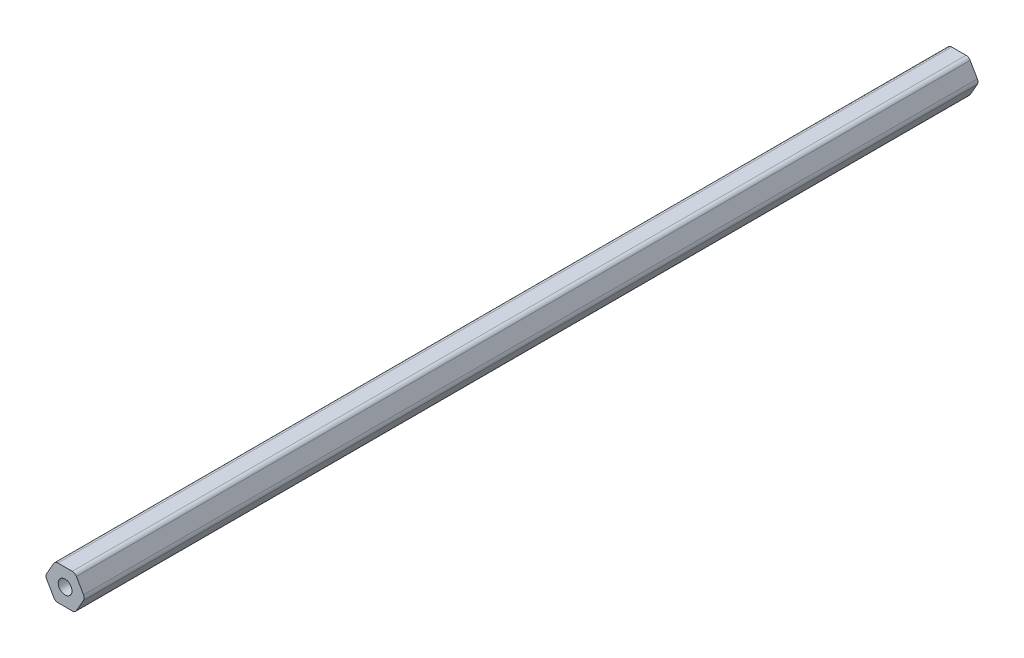
ISO-10303-21;
HEADER;
FILE_DESCRIPTION(('STEP AP214'),'2;1');
FILE_NAME('part.step','',(''),(''),'','','');
FILE_SCHEMA(('AUTOMOTIVE_DESIGN { 1 0 10303 214 1 1 1 1 }'));
ENDSEC;
DATA;
#1=APPLICATION_CONTEXT('core data for automotive mechanical design processes');
#2=APPLICATION_PROTOCOL_DEFINITION('international standard','automotive_design',2000,#1);
#3=PRODUCT_CONTEXT('',#1,'mechanical');
#4=PRODUCT('Part','Part','',(#3));
#5=PRODUCT_RELATED_PRODUCT_CATEGORY('part','',(#4));
#6=PRODUCT_DEFINITION_FORMATION('','',#4);
#7=PRODUCT_DEFINITION_CONTEXT('part definition',#1,'design');
#8=PRODUCT_DEFINITION('design','',#6,#7);
#9=PRODUCT_DEFINITION_SHAPE('','',#8);
#10=(LENGTH_UNIT() NAMED_UNIT(*) SI_UNIT(.MILLI.,.METRE.));
#11=(NAMED_UNIT(*) PLANE_ANGLE_UNIT() SI_UNIT($,.RADIAN.));
#12=(NAMED_UNIT(*) SI_UNIT($,.STERADIAN.) SOLID_ANGLE_UNIT());
#13=UNCERTAINTY_MEASURE_WITH_UNIT(LENGTH_MEASURE(1.E-05),#10,'distance_accuracy_value','');
#14=(GEOMETRIC_REPRESENTATION_CONTEXT(3) GLOBAL_UNCERTAINTY_ASSIGNED_CONTEXT((#13)) GLOBAL_UNIT_ASSIGNED_CONTEXT((#10,
#11,#12)) REPRESENTATION_CONTEXT('',''));
#15=CARTESIAN_POINT('',(0.,0.,0.));
#16=DIRECTION('',(0.,0.,1.));
#17=DIRECTION('',(1.,0.,0.));
#18=AXIS2_PLACEMENT_3D('',#15,#16,#17);
#19=CARTESIAN_POINT('',(0.,0.,330.2));
#20=DIRECTION('',(0.,0.,1.));
#21=DIRECTION('',(1.,0.,0.));
#22=AXIS2_PLACEMENT_3D('',#19,#20,#21);
#23=PLANE('',#22);
#24=DIRECTION('',(-0.499999999999995,-0.866025403784442,0.));
#25=VECTOR('',#24,1.);
#26=CARTESIAN_POINT('',(-4.29020386201017,9.04112787707909,330.2));
#27=LINE('',#26,#25);
#28=CARTESIAN_POINT('',(-4.80346825131974,8.15212787707908,330.2));
#29=VERTEX_POINT('',#28);
#30=CARTESIAN_POINT('',(-7.44311368205469,3.58012787707905,330.2));
#31=VERTEX_POINT('',#30);
#32=EDGE_CURVE('E273',#29,#31,#27,.T.);
#33=ORIENTED_EDGE('',*,*,#32,.T.);
#34=CARTESIAN_POINT('',(-5.90332051412595,2.69112787707906,330.2));
#35=DIRECTION('',(0.,0.,1.));
#36=DIRECTION('',(1.,0.,0.));
#37=AXIS2_PLACEMENT_3D('',#34,#35,#36);
#38=CIRCLE('',#37,1.778);
#39=CARTESIAN_POINT('',(-7.44311368205468,1.80212787707905,330.2));
#40=VERTEX_POINT('',#39);
#41=EDGE_CURVE('E210',#31,#40,#38,.T.);
#42=ORIENTED_EDGE('',*,*,#41,.T.);
#43=DIRECTION('',(0.500000000000007,-0.866025403784434,0.));
#44=VECTOR('',#43,1.);
#45=CARTESIAN_POINT('',(-7.95637807136426,2.69112787707905,330.2));
#46=LINE('',#45,#44);
#47=CARTESIAN_POINT('',(-4.80346825131967,-2.76987212292094,330.2));
#48=VERTEX_POINT('',#47);
#49=EDGE_CURVE('E155',#40,#48,#46,.T.);
#50=ORIENTED_EDGE('',*,*,#49,.T.);
#51=CARTESIAN_POINT('',(-3.26367508339094,-1.88087212292093,330.2));
#52=DIRECTION('',(0.,0.,1.));
#53=DIRECTION('',(1.,0.,0.));
#54=AXIS2_PLACEMENT_3D('',#51,#52,#53);
#55=CIRCLE('',#54,1.778);
#56=CARTESIAN_POINT('',(-3.26367508339092,-3.65887212292093,330.2));
#57=VERTEX_POINT('',#56);
#58=EDGE_CURVE('E66',#48,#57,#55,.T.);
#59=ORIENTED_EDGE('',*,*,#58,.T.);
#60=DIRECTION('',(1.,0.,0.));
#61=VECTOR('',#60,1.);
#62=CARTESIAN_POINT('',(-4.29020386201008,-3.65887212292094,330.2));
#63=LINE('',#62,#61);
#64=CARTESIAN_POINT('',(2.01561577807904,-3.65887212292087,330.2));
#65=VERTEX_POINT('',#64);
#66=EDGE_CURVE('E177',#57,#65,#63,.T.);
#67=ORIENTED_EDGE('',*,*,#66,.T.);
#68=CARTESIAN_POINT('',(2.01561577807902,-1.88087212292087,330.2));
#69=DIRECTION('',(0.,0.,1.));
#70=DIRECTION('',(1.,0.,0.));
#71=AXIS2_PLACEMENT_3D('',#68,#69,#70);
#72=CIRCLE('',#71,1.778);
#73=CARTESIAN_POINT('',(3.55540894600776,-2.76987212292086,330.2));
#74=VERTEX_POINT('',#73);
#75=EDGE_CURVE('E202',#65,#74,#72,.T.);
#76=ORIENTED_EDGE('',*,*,#75,.T.);
#77=DIRECTION('',(0.499999999999995,0.866025403784441,0.));
#78=VECTOR('',#77,1.);
#79=CARTESIAN_POINT('',(3.04214455669819,-3.65887212292086,330.2));
#80=LINE('',#79,#78);
#81=CARTESIAN_POINT('',(6.19505437674267,1.8021278770791,330.2));
#82=VERTEX_POINT('',#81);
#83=EDGE_CURVE('E170',#74,#82,#80,.T.);
#84=ORIENTED_EDGE('',*,*,#83,.T.);
#85=CARTESIAN_POINT('',(4.65526120881393,2.69112787707909,330.2));
#86=DIRECTION('',(0.,0.,1.));
#87=DIRECTION('',(1.,0.,0.));
#88=AXIS2_PLACEMENT_3D('',#85,#86,#87);
#89=CIRCLE('',#88,1.778);
#90=CARTESIAN_POINT('',(6.19505437674266,3.58012787707909,330.2));
#91=VERTEX_POINT('',#90);
#92=EDGE_CURVE('E199',#82,#91,#89,.T.);
#93=ORIENTED_EDGE('',*,*,#92,.T.);
#94=DIRECTION('',(-0.500000000000001,0.866025403784438,0.));
#95=VECTOR('',#94,1.);
#96=CARTESIAN_POINT('',(6.70831876605224,2.6911278770791,330.2));
#97=LINE('',#96,#95);
#98=CARTESIAN_POINT('',(3.55540894600768,8.15212787707911,330.2));
#99=VERTEX_POINT('',#98);
#100=EDGE_CURVE('E239',#91,#99,#97,.T.);
#101=ORIENTED_EDGE('',*,*,#100,.T.);
#102=CARTESIAN_POINT('',(2.01561577807895,7.26312787707911,330.2));
#103=DIRECTION('',(0.,0.,1.));
#104=DIRECTION('',(1.,0.,0.));
#105=AXIS2_PLACEMENT_3D('',#102,#103,#104);
#106=CIRCLE('',#105,1.778);
#107=CARTESIAN_POINT('',(2.01561577807894,9.04112787707911,330.2));
#108=VERTEX_POINT('',#107);
#109=EDGE_CURVE('E196',#99,#108,#106,.T.);
#110=ORIENTED_EDGE('',*,*,#109,.T.);
#111=DIRECTION('',(-1.,0.,0.));
#112=VECTOR('',#111,1.);
#113=CARTESIAN_POINT('',(3.0421445566981,9.04112787707911,330.2));
#114=LINE('',#113,#112);
#115=CARTESIAN_POINT('',(-3.26367508339101,9.04112787707909,330.2));
#116=VERTEX_POINT('',#115);
#117=EDGE_CURVE('E252',#108,#116,#114,.T.);
#118=ORIENTED_EDGE('',*,*,#117,.T.);
#119=CARTESIAN_POINT('',(-3.263675083391,7.26312787707909,330.2));
#120=DIRECTION('',(0.,0.,1.));
#121=DIRECTION('',(1.,0.,0.));
#122=AXIS2_PLACEMENT_3D('',#119,#120,#121);
#123=CIRCLE('',#122,1.778);
#124=EDGE_CURVE('E207',#116,#29,#123,.T.);
#125=ORIENTED_EDGE('',*,*,#124,.T.);
#126=EDGE_LOOP('',(#33,#42,#50,#59,#67,#76,#84,#93,#101,#110,#118,#125));
#127=FACE_BOUND('',#126,.T.);
#128=CARTESIAN_POINT('',(-0.624029652656013,2.6911278770791,330.2));
#129=DIRECTION('',(0.,0.,1.));
#130=DIRECTION('',(1.,0.,0.));
#131=AXIS2_PLACEMENT_3D('',#128,#129,#130);
#132=CIRCLE('',#131,2.54);
#133=CARTESIAN_POINT('',(1.91597034734399,2.6911278770791,330.2));
#134=VERTEX_POINT('',#133);
#135=EDGE_CURVE('E268',#134,#134,#132,.T.);
#136=ORIENTED_EDGE('',*,*,#135,.F.);
#137=EDGE_LOOP('',(#136));
#138=FACE_BOUND('',#137,.T.);
#139=ADVANCED_FACE('F43',(#127,#138),#23,.T.);
#140=CARTESIAN_POINT('',(0.,0.,0.));
#141=DIRECTION('',(0.,0.,1.));
#142=DIRECTION('',(1.,0.,0.));
#143=AXIS2_PLACEMENT_3D('',#140,#141,#142);
#144=PLANE('',#143);
#145=DIRECTION('',(0.500000000000007,-0.866025403784434,0.));
#146=VECTOR('',#145,1.);
#147=CARTESIAN_POINT('',(-7.95637807136426,2.69112787707905,0.));
#148=LINE('',#147,#146);
#149=CARTESIAN_POINT('',(-7.44311368205468,1.80212787707905,0.));
#150=VERTEX_POINT('',#149);
#151=CARTESIAN_POINT('',(-4.80346825131967,-2.76987212292094,0.));
#152=VERTEX_POINT('',#151);
#153=EDGE_CURVE('E153',#150,#152,#148,.T.);
#154=ORIENTED_EDGE('',*,*,#153,.F.);
#155=CARTESIAN_POINT('',(-5.90332051412595,2.69112787707906,0.));
#156=DIRECTION('',(0.,0.,1.));
#157=DIRECTION('',(1.,0.,0.));
#158=AXIS2_PLACEMENT_3D('',#155,#156,#157);
#159=CIRCLE('',#158,1.778);
#160=CARTESIAN_POINT('',(-7.44311368205469,3.58012787707905,0.));
#161=VERTEX_POINT('',#160);
#162=EDGE_CURVE('E135',#150,#161,#159,.F.);
#163=ORIENTED_EDGE('',*,*,#162,.T.);
#164=DIRECTION('',(-0.499999999999995,-0.866025403784442,0.));
#165=VECTOR('',#164,1.);
#166=CARTESIAN_POINT('',(-4.29020386201017,9.04112787707909,0.));
#167=LINE('',#166,#165);
#168=CARTESIAN_POINT('',(-4.80346825131974,8.15212787707908,0.));
#169=VERTEX_POINT('',#168);
#170=EDGE_CURVE('E166',#169,#161,#167,.T.);
#171=ORIENTED_EDGE('',*,*,#170,.F.);
#172=CARTESIAN_POINT('',(-3.263675083391,7.26312787707909,0.));
#173=DIRECTION('',(0.,0.,1.));
#174=DIRECTION('',(1.,0.,0.));
#175=AXIS2_PLACEMENT_3D('',#172,#173,#174);
#176=CIRCLE('',#175,1.778);
#177=CARTESIAN_POINT('',(-3.26367508339101,9.04112787707909,0.));
#178=VERTEX_POINT('',#177);
#179=EDGE_CURVE('E147',#169,#178,#176,.F.);
#180=ORIENTED_EDGE('',*,*,#179,.T.);
#181=DIRECTION('',(-1.,0.,0.));
#182=VECTOR('',#181,1.);
#183=CARTESIAN_POINT('',(3.0421445566981,9.04112787707911,0.));
#184=LINE('',#183,#182);
#185=CARTESIAN_POINT('',(2.01561577807894,9.04112787707911,0.));
#186=VERTEX_POINT('',#185);
#187=EDGE_CURVE('E172',#186,#178,#184,.T.);
#188=ORIENTED_EDGE('',*,*,#187,.F.);
#189=CARTESIAN_POINT('',(2.01561577807895,7.26312787707911,0.));
#190=DIRECTION('',(0.,0.,1.));
#191=DIRECTION('',(1.,0.,0.));
#192=AXIS2_PLACEMENT_3D('',#189,#190,#191);
#193=CIRCLE('',#192,1.778);
#194=CARTESIAN_POINT('',(3.55540894600768,8.15212787707911,0.));
#195=VERTEX_POINT('',#194);
#196=EDGE_CURVE('E157',#186,#195,#193,.F.);
#197=ORIENTED_EDGE('',*,*,#196,.T.);
#198=DIRECTION('',(-0.500000000000001,0.866025403784438,0.));
#199=VECTOR('',#198,1.);
#200=CARTESIAN_POINT('',(6.70831876605224,2.6911278770791,0.));
#201=LINE('',#200,#199);
#202=CARTESIAN_POINT('',(6.19505437674266,3.58012787707909,0.));
#203=VERTEX_POINT('',#202);
#204=EDGE_CURVE('E242',#203,#195,#201,.T.);
#205=ORIENTED_EDGE('',*,*,#204,.F.);
#206=CARTESIAN_POINT('',(4.65526120881393,2.69112787707909,0.));
#207=DIRECTION('',(0.,0.,1.));
#208=DIRECTION('',(1.,0.,0.));
#209=AXIS2_PLACEMENT_3D('',#206,#207,#208);
#210=CIRCLE('',#209,1.778);
#211=CARTESIAN_POINT('',(6.19505437674267,1.8021278770791,0.));
#212=VERTEX_POINT('',#211);
#213=EDGE_CURVE('E181',#203,#212,#210,.F.);
#214=ORIENTED_EDGE('',*,*,#213,.T.);
#215=DIRECTION('',(0.499999999999995,0.866025403784441,0.));
#216=VECTOR('',#215,1.);
#217=CARTESIAN_POINT('',(3.04214455669819,-3.65887212292086,0.));
#218=LINE('',#217,#216);
#219=CARTESIAN_POINT('',(3.55540894600776,-2.76987212292086,0.));
#220=VERTEX_POINT('',#219);
#221=EDGE_CURVE('E262',#220,#212,#218,.T.);
#222=ORIENTED_EDGE('',*,*,#221,.F.);
#223=CARTESIAN_POINT('',(2.01561577807902,-1.88087212292087,0.));
#224=DIRECTION('',(0.,0.,1.));
#225=DIRECTION('',(1.,0.,0.));
#226=AXIS2_PLACEMENT_3D('',#223,#224,#225);
#227=CIRCLE('',#226,1.778);
#228=CARTESIAN_POINT('',(2.01561577807904,-3.65887212292087,0.));
#229=VERTEX_POINT('',#228);
#230=EDGE_CURVE('E184',#220,#229,#227,.F.);
#231=ORIENTED_EDGE('',*,*,#230,.T.);
#232=DIRECTION('',(1.,0.,0.));
#233=VECTOR('',#232,1.);
#234=CARTESIAN_POINT('',(-4.29020386201008,-3.65887212292094,0.));
#235=LINE('',#234,#233);
#236=CARTESIAN_POINT('',(-3.26367508339092,-3.65887212292093,0.));
#237=VERTEX_POINT('',#236);
#238=EDGE_CURVE('E165',#237,#229,#235,.T.);
#239=ORIENTED_EDGE('',*,*,#238,.F.);
#240=CARTESIAN_POINT('',(-3.26367508339094,-1.88087212292093,0.));
#241=DIRECTION('',(0.,0.,1.));
#242=DIRECTION('',(1.,0.,0.));
#243=AXIS2_PLACEMENT_3D('',#240,#241,#242);
#244=CIRCLE('',#243,1.778);
#245=EDGE_CURVE('E163',#237,#152,#244,.F.);
#246=ORIENTED_EDGE('',*,*,#245,.T.);
#247=EDGE_LOOP('',(#154,#163,#171,#180,#188,#197,#205,#214,#222,#231,#239,#246));
#248=FACE_BOUND('',#247,.T.);
#249=CARTESIAN_POINT('',(-0.624029652656013,2.6911278770791,0.));
#250=DIRECTION('',(0.,0.,1.));
#251=DIRECTION('',(1.,0.,0.));
#252=AXIS2_PLACEMENT_3D('',#249,#250,#251);
#253=CIRCLE('',#252,2.54);
#254=CARTESIAN_POINT('',(1.91597034734399,2.6911278770791,0.));
#255=VERTEX_POINT('',#254);
#256=EDGE_CURVE('E280',#255,#255,#253,.T.);
#257=ORIENTED_EDGE('',*,*,#256,.T.);
#258=EDGE_LOOP('',(#257));
#259=FACE_BOUND('',#258,.T.);
#260=ADVANCED_FACE('F160',(#248,#259),#144,.F.);
#261=CARTESIAN_POINT('',(3.04214455669819,-3.65887212292086,330.2));
#262=DIRECTION('',(-0.866025403784441,0.499999999999995,0.));
#263=DIRECTION('',(-0.499999999999995,-0.866025403784442,0.));
#264=AXIS2_PLACEMENT_3D('',#261,#262,#263);
#265=PLANE('',#264);
#266=ORIENTED_EDGE('',*,*,#83,.F.);
#267=DIRECTION('',(0.,0.,-1.));
#268=VECTOR('',#267,1.);
#269=CARTESIAN_POINT('',(3.55540894600776,-2.76987212292086,330.2));
#270=LINE('',#269,#268);
#271=EDGE_CURVE('E229',#74,#220,#270,.T.);
#272=ORIENTED_EDGE('',*,*,#271,.T.);
#273=ORIENTED_EDGE('',*,*,#221,.T.);
#274=DIRECTION('',(0.,0.,-1.));
#275=VECTOR('',#274,1.);
#276=CARTESIAN_POINT('',(6.19505437674267,1.8021278770791,330.2));
#277=LINE('',#276,#275);
#278=EDGE_CURVE('E226',#212,#82,#277,.F.);
#279=ORIENTED_EDGE('',*,*,#278,.T.);
#280=EDGE_LOOP('',(#266,#272,#273,#279));
#281=FACE_BOUND('',#280,.T.);
#282=ADVANCED_FACE('F295',(#281),#265,.F.);
#283=CARTESIAN_POINT('',(6.70831876605224,2.6911278770791,330.2));
#284=DIRECTION('',(-0.866025403784438,-0.500000000000001,0.));
#285=DIRECTION('',(0.500000000000001,-0.866025403784438,0.));
#286=AXIS2_PLACEMENT_3D('',#283,#284,#285);
#287=PLANE('',#286);
#288=ORIENTED_EDGE('',*,*,#100,.F.);
#289=DIRECTION('',(0.,0.,-1.));
#290=VECTOR('',#289,1.);
#291=CARTESIAN_POINT('',(6.19505437674266,3.58012787707909,330.2));
#292=LINE('',#291,#290);
#293=EDGE_CURVE('E11',#91,#203,#292,.T.);
#294=ORIENTED_EDGE('',*,*,#293,.T.);
#295=ORIENTED_EDGE('',*,*,#204,.T.);
#296=DIRECTION('',(0.,0.,-1.));
#297=VECTOR('',#296,1.);
#298=CARTESIAN_POINT('',(3.55540894600768,8.15212787707911,330.2));
#299=LINE('',#298,#297);
#300=EDGE_CURVE('E52',#195,#99,#299,.F.);
#301=ORIENTED_EDGE('',*,*,#300,.T.);
#302=EDGE_LOOP('',(#288,#294,#295,#301));
#303=FACE_BOUND('',#302,.T.);
#304=ADVANCED_FACE('F238',(#303),#287,.F.);
#305=CARTESIAN_POINT('',(3.0421445566981,9.04112787707911,330.2));
#306=DIRECTION('',(0.,-1.,0.));
#307=DIRECTION('',(1.,0.,0.));
#308=AXIS2_PLACEMENT_3D('',#305,#306,#307);
#309=PLANE('',#308);
#310=ORIENTED_EDGE('',*,*,#187,.T.);
#311=DIRECTION('',(0.,0.,-1.));
#312=VECTOR('',#311,1.);
#313=CARTESIAN_POINT('',(-3.26367508339101,9.04112787707909,330.2));
#314=LINE('',#313,#312);
#315=EDGE_CURVE('E217',#178,#116,#314,.F.);
#316=ORIENTED_EDGE('',*,*,#315,.T.);
#317=ORIENTED_EDGE('',*,*,#117,.F.);
#318=DIRECTION('',(0.,0.,-1.));
#319=VECTOR('',#318,1.);
#320=CARTESIAN_POINT('',(2.01561577807894,9.04112787707911,330.2));
#321=LINE('',#320,#319);
#322=EDGE_CURVE('E213',#108,#186,#321,.T.);
#323=ORIENTED_EDGE('',*,*,#322,.T.);
#324=EDGE_LOOP('',(#310,#316,#317,#323));
#325=FACE_BOUND('',#324,.T.);
#326=ADVANCED_FACE('F258',(#325),#309,.F.);
#327=CARTESIAN_POINT('',(-4.29020386201017,9.04112787707909,330.2));
#328=DIRECTION('',(0.866025403784442,-0.499999999999995,0.));
#329=DIRECTION('',(0.499999999999995,0.866025403784442,0.));
#330=AXIS2_PLACEMENT_3D('',#327,#328,#329);
#331=PLANE('',#330);
#332=ORIENTED_EDGE('',*,*,#170,.T.);
#333=DIRECTION('',(0.,0.,-1.));
#334=VECTOR('',#333,1.);
#335=CARTESIAN_POINT('',(-7.44311368205469,3.58012787707905,330.2));
#336=LINE('',#335,#334);
#337=EDGE_CURVE('E140',#161,#31,#336,.F.);
#338=ORIENTED_EDGE('',*,*,#337,.T.);
#339=ORIENTED_EDGE('',*,*,#32,.F.);
#340=DIRECTION('',(0.,0.,-1.));
#341=VECTOR('',#340,1.);
#342=CARTESIAN_POINT('',(-4.80346825131974,8.15212787707908,330.2));
#343=LINE('',#342,#341);
#344=EDGE_CURVE('E146',#29,#169,#343,.T.);
#345=ORIENTED_EDGE('',*,*,#344,.T.);
#346=EDGE_LOOP('',(#332,#338,#339,#345));
#347=FACE_BOUND('',#346,.T.);
#348=ADVANCED_FACE('F304',(#347),#331,.F.);
#349=CARTESIAN_POINT('',(-7.95637807136426,2.69112787707905,330.2));
#350=DIRECTION('',(0.866025403784435,0.500000000000007,0.));
#351=DIRECTION('',(-0.500000000000007,0.866025403784435,0.));
#352=AXIS2_PLACEMENT_3D('',#349,#350,#351);
#353=PLANE('',#352);
#354=ORIENTED_EDGE('',*,*,#49,.F.);
#355=DIRECTION('',(0.,0.,-1.));
#356=VECTOR('',#355,1.);
#357=CARTESIAN_POINT('',(-7.44311368205468,1.80212787707905,330.2));
#358=LINE('',#357,#356);
#359=EDGE_CURVE('E139',#40,#150,#358,.T.);
#360=ORIENTED_EDGE('',*,*,#359,.T.);
#361=ORIENTED_EDGE('',*,*,#153,.T.);
#362=DIRECTION('',(0.,0.,-1.));
#363=VECTOR('',#362,1.);
#364=CARTESIAN_POINT('',(-4.80346825131967,-2.76987212292094,330.2));
#365=LINE('',#364,#363);
#366=EDGE_CURVE('E158',#152,#48,#365,.F.);
#367=ORIENTED_EDGE('',*,*,#366,.T.);
#368=EDGE_LOOP('',(#354,#360,#361,#367));
#369=FACE_BOUND('',#368,.T.);
#370=ADVANCED_FACE('F152',(#369),#353,.F.);
#371=CARTESIAN_POINT('',(-4.29020386201008,-3.65887212292094,330.2));
#372=DIRECTION('',(0.,1.,0.));
#373=DIRECTION('',(-1.,0.,0.));
#374=AXIS2_PLACEMENT_3D('',#371,#372,#373);
#375=PLANE('',#374);
#376=ORIENTED_EDGE('',*,*,#66,.F.);
#377=DIRECTION('',(0.,0.,-1.));
#378=VECTOR('',#377,1.);
#379=CARTESIAN_POINT('',(-3.26367508339092,-3.65887212292093,330.2));
#380=LINE('',#379,#378);
#381=EDGE_CURVE('E222',#57,#237,#380,.T.);
#382=ORIENTED_EDGE('',*,*,#381,.T.);
#383=ORIENTED_EDGE('',*,*,#238,.T.);
#384=DIRECTION('',(0.,0.,-1.));
#385=VECTOR('',#384,1.);
#386=CARTESIAN_POINT('',(2.01561577807904,-3.65887212292087,330.2));
#387=LINE('',#386,#385);
#388=EDGE_CURVE('E59',#229,#65,#387,.F.);
#389=ORIENTED_EDGE('',*,*,#388,.T.);
#390=EDGE_LOOP('',(#376,#382,#383,#389));
#391=FACE_BOUND('',#390,.T.);
#392=ADVANCED_FACE('F299',(#391),#375,.F.);
#393=CARTESIAN_POINT('',(-0.624029652656013,2.6911278770791,330.2));
#394=DIRECTION('',(0.,0.,-1.));
#395=DIRECTION('',(-1.,0.,0.));
#396=AXIS2_PLACEMENT_3D('',#393,#394,#395);
#397=CYLINDRICAL_SURFACE('',#396,2.54);
#398=ORIENTED_EDGE('',*,*,#135,.T.);
#399=EDGE_LOOP('',(#398));
#400=FACE_BOUND('',#399,.T.);
#401=ORIENTED_EDGE('',*,*,#256,.F.);
#402=EDGE_LOOP('',(#401));
#403=FACE_BOUND('',#402,.T.);
#404=ADVANCED_FACE('F288',(#400,#403),#397,.F.);
#405=CARTESIAN_POINT('',(-5.90332051412595,2.69112787707906,330.2));
#406=DIRECTION('',(0.,0.,-1.));
#407=DIRECTION('',(-1.,0.,0.));
#408=AXIS2_PLACEMENT_3D('',#405,#406,#407);
#409=CYLINDRICAL_SURFACE('',#408,1.778);
#410=ORIENTED_EDGE('',*,*,#41,.F.);
#411=ORIENTED_EDGE('',*,*,#337,.F.);
#412=ORIENTED_EDGE('',*,*,#162,.F.);
#413=ORIENTED_EDGE('',*,*,#359,.F.);
#414=EDGE_LOOP('',(#410,#411,#412,#413));
#415=FACE_BOUND('',#414,.T.);
#416=ADVANCED_FACE('F138',(#415),#409,.T.);
#417=CARTESIAN_POINT('',(-3.263675083391,7.26312787707909,330.2));
#418=DIRECTION('',(0.,0.,-1.));
#419=DIRECTION('',(-1.,0.,0.));
#420=AXIS2_PLACEMENT_3D('',#417,#418,#419);
#421=CYLINDRICAL_SURFACE('',#420,1.778);
#422=ORIENTED_EDGE('',*,*,#124,.F.);
#423=ORIENTED_EDGE('',*,*,#315,.F.);
#424=ORIENTED_EDGE('',*,*,#179,.F.);
#425=ORIENTED_EDGE('',*,*,#344,.F.);
#426=EDGE_LOOP('',(#422,#423,#424,#425));
#427=FACE_BOUND('',#426,.T.);
#428=ADVANCED_FACE('F317',(#427),#421,.T.);
#429=CARTESIAN_POINT('',(-3.26367508339094,-1.88087212292093,330.2));
#430=DIRECTION('',(0.,0.,-1.));
#431=DIRECTION('',(-1.,0.,0.));
#432=AXIS2_PLACEMENT_3D('',#429,#430,#431);
#433=CYLINDRICAL_SURFACE('',#432,1.778);
#434=ORIENTED_EDGE('',*,*,#58,.F.);
#435=ORIENTED_EDGE('',*,*,#366,.F.);
#436=ORIENTED_EDGE('',*,*,#245,.F.);
#437=ORIENTED_EDGE('',*,*,#381,.F.);
#438=EDGE_LOOP('',(#434,#435,#436,#437));
#439=FACE_BOUND('',#438,.T.);
#440=ADVANCED_FACE('F320',(#439),#433,.T.);
#441=CARTESIAN_POINT('',(2.01561577807902,-1.88087212292087,330.2));
#442=DIRECTION('',(0.,0.,-1.));
#443=DIRECTION('',(-1.,0.,0.));
#444=AXIS2_PLACEMENT_3D('',#441,#442,#443);
#445=CYLINDRICAL_SURFACE('',#444,1.778);
#446=ORIENTED_EDGE('',*,*,#75,.F.);
#447=ORIENTED_EDGE('',*,*,#388,.F.);
#448=ORIENTED_EDGE('',*,*,#230,.F.);
#449=ORIENTED_EDGE('',*,*,#271,.F.);
#450=EDGE_LOOP('',(#446,#447,#448,#449));
#451=FACE_BOUND('',#450,.T.);
#452=ADVANCED_FACE('F324',(#451),#445,.T.);
#453=CARTESIAN_POINT('',(4.65526120881393,2.69112787707909,330.2));
#454=DIRECTION('',(0.,0.,-1.));
#455=DIRECTION('',(-1.,0.,0.));
#456=AXIS2_PLACEMENT_3D('',#453,#454,#455);
#457=CYLINDRICAL_SURFACE('',#456,1.778);
#458=ORIENTED_EDGE('',*,*,#92,.F.);
#459=ORIENTED_EDGE('',*,*,#278,.F.);
#460=ORIENTED_EDGE('',*,*,#213,.F.);
#461=ORIENTED_EDGE('',*,*,#293,.F.);
#462=EDGE_LOOP('',(#458,#459,#460,#461));
#463=FACE_BOUND('',#462,.T.);
#464=ADVANCED_FACE('F327',(#463),#457,.T.);
#465=CARTESIAN_POINT('',(2.01561577807895,7.26312787707911,330.2));
#466=DIRECTION('',(0.,0.,-1.));
#467=DIRECTION('',(-1.,0.,0.));
#468=AXIS2_PLACEMENT_3D('',#465,#466,#467);
#469=CYLINDRICAL_SURFACE('',#468,1.778);
#470=ORIENTED_EDGE('',*,*,#109,.F.);
#471=ORIENTED_EDGE('',*,*,#300,.F.);
#472=ORIENTED_EDGE('',*,*,#196,.F.);
#473=ORIENTED_EDGE('',*,*,#322,.F.);
#474=EDGE_LOOP('',(#470,#471,#472,#473));
#475=FACE_BOUND('',#474,.T.);
#476=ADVANCED_FACE('F45',(#475),#469,.T.);
#477=CLOSED_SHELL('',(#139,#260,#282,#304,#326,#348,#370,#392,#404,#416,#428,#440,#452,#464,#476));
#478=MANIFOLD_SOLID_BREP('B2',#477);
#479=ADVANCED_BREP_SHAPE_REPRESENTATION('',(#18,#478),#14);
#480=SHAPE_DEFINITION_REPRESENTATION(#9,#479);
ENDSEC;
END-ISO-10303-21;
